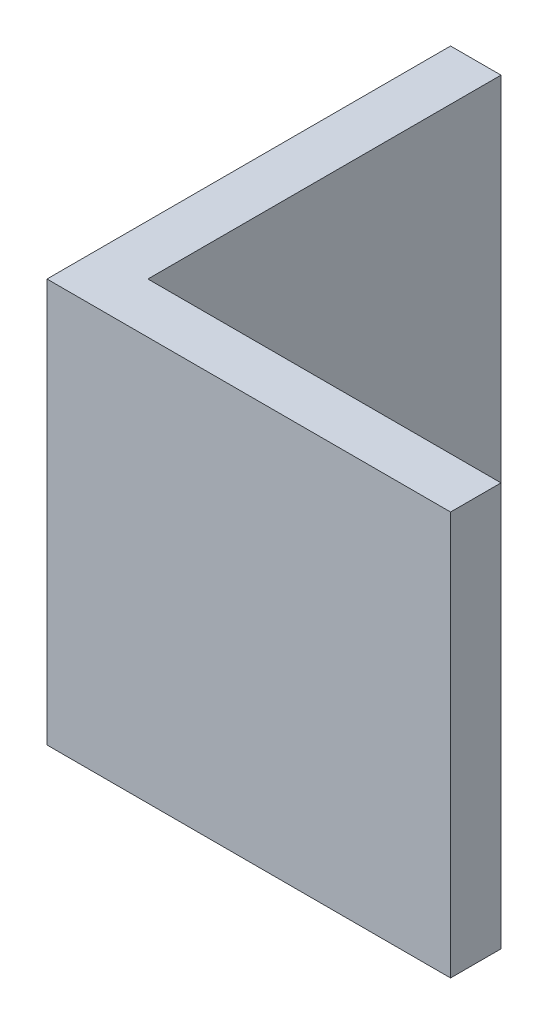
ISO-10303-21;
HEADER;
FILE_DESCRIPTION(('STEP AP214'),'2;1');
FILE_NAME('part.step','',(''),(''),'','','');
FILE_SCHEMA(('AUTOMOTIVE_DESIGN { 1 0 10303 214 1 1 1 1 }'));
ENDSEC;
DATA;
#1=APPLICATION_CONTEXT('core data for automotive mechanical design processes');
#2=APPLICATION_PROTOCOL_DEFINITION('international standard','automotive_design',2000,#1);
#3=PRODUCT_CONTEXT('',#1,'mechanical');
#4=PRODUCT('Part','Part','',(#3));
#5=PRODUCT_RELATED_PRODUCT_CATEGORY('part','',(#4));
#6=PRODUCT_DEFINITION_FORMATION('','',#4);
#7=PRODUCT_DEFINITION_CONTEXT('part definition',#1,'design');
#8=PRODUCT_DEFINITION('design','',#6,#7);
#9=PRODUCT_DEFINITION_SHAPE('','',#8);
#10=(LENGTH_UNIT() NAMED_UNIT(*) SI_UNIT(.MILLI.,.METRE.));
#11=(NAMED_UNIT(*) PLANE_ANGLE_UNIT() SI_UNIT($,.RADIAN.));
#12=(NAMED_UNIT(*) SI_UNIT($,.STERADIAN.) SOLID_ANGLE_UNIT());
#13=UNCERTAINTY_MEASURE_WITH_UNIT(LENGTH_MEASURE(1.E-05),#10,'distance_accuracy_value','');
#14=(GEOMETRIC_REPRESENTATION_CONTEXT(3) GLOBAL_UNCERTAINTY_ASSIGNED_CONTEXT((#13)) GLOBAL_UNIT_ASSIGNED_CONTEXT((#10,
#11,#12)) REPRESENTATION_CONTEXT('',''));
#15=CARTESIAN_POINT('',(0.,0.,0.));
#16=DIRECTION('',(0.,0.,1.));
#17=DIRECTION('',(1.,0.,0.));
#18=AXIS2_PLACEMENT_3D('',#15,#16,#17);
#19=CARTESIAN_POINT('',(0.,25.4,0.));
#20=DIRECTION('',(0.,0.,-1.));
#21=DIRECTION('',(-1.,0.,0.));
#22=AXIS2_PLACEMENT_3D('',#19,#20,#21);
#23=PLANE('',#22);
#24=DIRECTION('',(1.,0.,0.));
#25=VECTOR('',#24,1.);
#26=CARTESIAN_POINT('',(0.,0.,0.));
#27=LINE('',#26,#25);
#28=CARTESIAN_POINT('',(0.,0.,0.));
#29=VERTEX_POINT('',#28);
#30=CARTESIAN_POINT('',(25.4,0.,0.));
#31=VERTEX_POINT('',#30);
#32=EDGE_CURVE('E117',#29,#31,#27,.T.);
#33=ORIENTED_EDGE('',*,*,#32,.T.);
#34=DIRECTION('',(0.,-1.,0.));
#35=VECTOR('',#34,1.);
#36=CARTESIAN_POINT('',(25.4,25.4,0.));
#37=LINE('',#36,#35);
#38=CARTESIAN_POINT('',(25.4,25.4,0.));
#39=VERTEX_POINT('',#38);
#40=EDGE_CURVE('E11',#39,#31,#37,.T.);
#41=ORIENTED_EDGE('',*,*,#40,.F.);
#42=DIRECTION('',(1.,0.,0.));
#43=VECTOR('',#42,1.);
#44=CARTESIAN_POINT('',(0.,25.4,0.));
#45=LINE('',#44,#43);
#46=CARTESIAN_POINT('',(0.,25.4,0.));
#47=VERTEX_POINT('',#46);
#48=EDGE_CURVE('E127',#47,#39,#45,.T.);
#49=ORIENTED_EDGE('',*,*,#48,.F.);
#50=DIRECTION('',(0.,-1.,0.));
#51=VECTOR('',#50,1.);
#52=CARTESIAN_POINT('',(0.,25.4,0.));
#53=LINE('',#52,#51);
#54=EDGE_CURVE('E113',#47,#29,#53,.T.);
#55=ORIENTED_EDGE('',*,*,#54,.T.);
#56=EDGE_LOOP('',(#33,#41,#49,#55));
#57=FACE_BOUND('',#56,.T.);
#58=ADVANCED_FACE('F33',(#57),#23,.F.);
#59=CARTESIAN_POINT('',(25.4,25.4,-3.175));
#60=DIRECTION('',(-1.,0.,0.));
#61=DIRECTION('',(0.,0.,1.));
#62=AXIS2_PLACEMENT_3D('',#59,#60,#61);
#63=PLANE('',#62);
#64=DIRECTION('',(0.,0.,-1.));
#65=VECTOR('',#64,1.);
#66=CARTESIAN_POINT('',(25.4,0.,-3.175));
#67=LINE('',#66,#65);
#68=CARTESIAN_POINT('',(25.4,0.,-3.175));
#69=VERTEX_POINT('',#68);
#70=EDGE_CURVE('E120',#31,#69,#67,.T.);
#71=ORIENTED_EDGE('',*,*,#70,.T.);
#72=DIRECTION('',(0.,-1.,0.));
#73=VECTOR('',#72,1.);
#74=CARTESIAN_POINT('',(25.4,25.4,-3.175));
#75=LINE('',#74,#73);
#76=CARTESIAN_POINT('',(25.4,25.4,-3.175));
#77=VERTEX_POINT('',#76);
#78=EDGE_CURVE('E41',#77,#69,#75,.T.);
#79=ORIENTED_EDGE('',*,*,#78,.F.);
#80=DIRECTION('',(0.,0.,-1.));
#81=VECTOR('',#80,1.);
#82=CARTESIAN_POINT('',(25.4,25.4,-3.175));
#83=LINE('',#82,#81);
#84=EDGE_CURVE('E86',#39,#77,#83,.T.);
#85=ORIENTED_EDGE('',*,*,#84,.F.);
#86=ORIENTED_EDGE('',*,*,#40,.T.);
#87=EDGE_LOOP('',(#71,#79,#85,#86));
#88=FACE_BOUND('',#87,.T.);
#89=ADVANCED_FACE('F151',(#88),#63,.F.);
#90=CARTESIAN_POINT('',(3.175,25.4,-3.175));
#91=DIRECTION('',(0.,0.,1.));
#92=DIRECTION('',(1.,0.,0.));
#93=AXIS2_PLACEMENT_3D('',#90,#91,#92);
#94=PLANE('',#93);
#95=DIRECTION('',(-1.,0.,0.));
#96=VECTOR('',#95,1.);
#97=CARTESIAN_POINT('',(3.175,0.,-3.175));
#98=LINE('',#97,#96);
#99=CARTESIAN_POINT('',(3.175,0.,-3.175));
#100=VERTEX_POINT('',#99);
#101=EDGE_CURVE('E122',#69,#100,#98,.T.);
#102=ORIENTED_EDGE('',*,*,#101,.T.);
#103=DIRECTION('',(0.,-1.,0.));
#104=VECTOR('',#103,1.);
#105=CARTESIAN_POINT('',(3.175,25.4,-3.175));
#106=LINE('',#105,#104);
#107=CARTESIAN_POINT('',(3.175,25.4,-3.175));
#108=VERTEX_POINT('',#107);
#109=EDGE_CURVE('E108',#108,#100,#106,.T.);
#110=ORIENTED_EDGE('',*,*,#109,.F.);
#111=DIRECTION('',(-1.,0.,0.));
#112=VECTOR('',#111,1.);
#113=CARTESIAN_POINT('',(3.175,25.4,-3.175));
#114=LINE('',#113,#112);
#115=EDGE_CURVE('E99',#77,#108,#114,.T.);
#116=ORIENTED_EDGE('',*,*,#115,.F.);
#117=ORIENTED_EDGE('',*,*,#78,.T.);
#118=EDGE_LOOP('',(#102,#110,#116,#117));
#119=FACE_BOUND('',#118,.T.);
#120=ADVANCED_FACE('F133',(#119),#94,.F.);
#121=CARTESIAN_POINT('',(3.175,25.4,-3.175));
#122=DIRECTION('',(-1.,0.,0.));
#123=DIRECTION('',(0.,0.,1.));
#124=AXIS2_PLACEMENT_3D('',#121,#122,#123);
#125=PLANE('',#124);
#126=DIRECTION('',(0.,0.,-1.));
#127=VECTOR('',#126,1.);
#128=CARTESIAN_POINT('',(3.175,0.,-3.175));
#129=LINE('',#128,#127);
#130=CARTESIAN_POINT('',(3.175,0.,-25.4));
#131=VERTEX_POINT('',#130);
#132=EDGE_CURVE('E107',#100,#131,#129,.T.);
#133=ORIENTED_EDGE('',*,*,#132,.T.);
#134=DIRECTION('',(0.,-1.,0.));
#135=VECTOR('',#134,1.);
#136=CARTESIAN_POINT('',(3.175,25.4,-25.4));
#137=LINE('',#136,#135);
#138=CARTESIAN_POINT('',(3.175,25.4,-25.4));
#139=VERTEX_POINT('',#138);
#140=EDGE_CURVE('E104',#139,#131,#137,.T.);
#141=ORIENTED_EDGE('',*,*,#140,.F.);
#142=DIRECTION('',(0.,0.,-1.));
#143=VECTOR('',#142,1.);
#144=CARTESIAN_POINT('',(3.175,25.4,-3.175));
#145=LINE('',#144,#143);
#146=EDGE_CURVE('E93',#108,#139,#145,.T.);
#147=ORIENTED_EDGE('',*,*,#146,.F.);
#148=ORIENTED_EDGE('',*,*,#109,.T.);
#149=EDGE_LOOP('',(#133,#141,#147,#148));
#150=FACE_BOUND('',#149,.T.);
#151=ADVANCED_FACE('F105',(#150),#125,.F.);
#152=CARTESIAN_POINT('',(0.,25.4,-25.4));
#153=DIRECTION('',(0.,0.,1.));
#154=DIRECTION('',(1.,0.,0.));
#155=AXIS2_PLACEMENT_3D('',#152,#153,#154);
#156=PLANE('',#155);
#157=DIRECTION('',(-1.,0.,0.));
#158=VECTOR('',#157,1.);
#159=CARTESIAN_POINT('',(0.,0.,-25.4));
#160=LINE('',#159,#158);
#161=CARTESIAN_POINT('',(0.,0.,-25.4));
#162=VERTEX_POINT('',#161);
#163=EDGE_CURVE('E72',#131,#162,#160,.T.);
#164=ORIENTED_EDGE('',*,*,#163,.T.);
#165=DIRECTION('',(0.,-1.,0.));
#166=VECTOR('',#165,1.);
#167=CARTESIAN_POINT('',(0.,25.4,-25.4));
#168=LINE('',#167,#166);
#169=CARTESIAN_POINT('',(0.,25.4,-25.4));
#170=VERTEX_POINT('',#169);
#171=EDGE_CURVE('E109',#170,#162,#168,.T.);
#172=ORIENTED_EDGE('',*,*,#171,.F.);
#173=DIRECTION('',(-1.,0.,0.));
#174=VECTOR('',#173,1.);
#175=CARTESIAN_POINT('',(0.,25.4,-25.4));
#176=LINE('',#175,#174);
#177=EDGE_CURVE('E97',#139,#170,#176,.T.);
#178=ORIENTED_EDGE('',*,*,#177,.F.);
#179=ORIENTED_EDGE('',*,*,#140,.T.);
#180=EDGE_LOOP('',(#164,#172,#178,#179));
#181=FACE_BOUND('',#180,.T.);
#182=ADVANCED_FACE('F111',(#181),#156,.F.);
#183=CARTESIAN_POINT('',(0.,25.4,0.));
#184=DIRECTION('',(1.,0.,0.));
#185=DIRECTION('',(0.,0.,-1.));
#186=AXIS2_PLACEMENT_3D('',#183,#184,#185);
#187=PLANE('',#186);
#188=DIRECTION('',(0.,0.,1.));
#189=VECTOR('',#188,1.);
#190=CARTESIAN_POINT('',(0.,0.,0.));
#191=LINE('',#190,#189);
#192=EDGE_CURVE('E78',#162,#29,#191,.T.);
#193=ORIENTED_EDGE('',*,*,#192,.T.);
#194=ORIENTED_EDGE('',*,*,#54,.F.);
#195=DIRECTION('',(0.,0.,1.));
#196=VECTOR('',#195,1.);
#197=CARTESIAN_POINT('',(0.,25.4,0.));
#198=LINE('',#197,#196);
#199=EDGE_CURVE('E49',#170,#47,#198,.T.);
#200=ORIENTED_EDGE('',*,*,#199,.F.);
#201=ORIENTED_EDGE('',*,*,#171,.T.);
#202=EDGE_LOOP('',(#193,#194,#200,#201));
#203=FACE_BOUND('',#202,.T.);
#204=ADVANCED_FACE('F140',(#203),#187,.F.);
#205=CARTESIAN_POINT('',(0.,25.4,0.));
#206=DIRECTION('',(0.,-1.,0.));
#207=DIRECTION('',(0.,0.,-1.));
#208=AXIS2_PLACEMENT_3D('',#205,#206,#207);
#209=PLANE('',#208);
#210=ORIENTED_EDGE('',*,*,#48,.T.);
#211=ORIENTED_EDGE('',*,*,#84,.T.);
#212=ORIENTED_EDGE('',*,*,#115,.T.);
#213=ORIENTED_EDGE('',*,*,#146,.T.);
#214=ORIENTED_EDGE('',*,*,#177,.T.);
#215=ORIENTED_EDGE('',*,*,#199,.T.);
#216=EDGE_LOOP('',(#210,#211,#212,#213,#214,#215));
#217=FACE_BOUND('',#216,.T.);
#218=ADVANCED_FACE('F95',(#217),#209,.F.);
#219=CARTESIAN_POINT('',(0.,0.,0.));
#220=DIRECTION('',(0.,-1.,0.));
#221=DIRECTION('',(0.,0.,-1.));
#222=AXIS2_PLACEMENT_3D('',#219,#220,#221);
#223=PLANE('',#222);
#224=ORIENTED_EDGE('',*,*,#32,.F.);
#225=ORIENTED_EDGE('',*,*,#192,.F.);
#226=ORIENTED_EDGE('',*,*,#163,.F.);
#227=ORIENTED_EDGE('',*,*,#132,.F.);
#228=ORIENTED_EDGE('',*,*,#101,.F.);
#229=ORIENTED_EDGE('',*,*,#70,.F.);
#230=EDGE_LOOP('',(#224,#225,#226,#227,#228,#229));
#231=FACE_BOUND('',#230,.T.);
#232=ADVANCED_FACE('F136',(#231),#223,.T.);
#233=CLOSED_SHELL('',(#58,#89,#120,#151,#182,#204,#218,#232));
#234=MANIFOLD_SOLID_BREP('B2',#233);
#235=ADVANCED_BREP_SHAPE_REPRESENTATION('',(#18,#234),#14);
#236=SHAPE_DEFINITION_REPRESENTATION(#9,#235);
ENDSEC;
END-ISO-10303-21;
